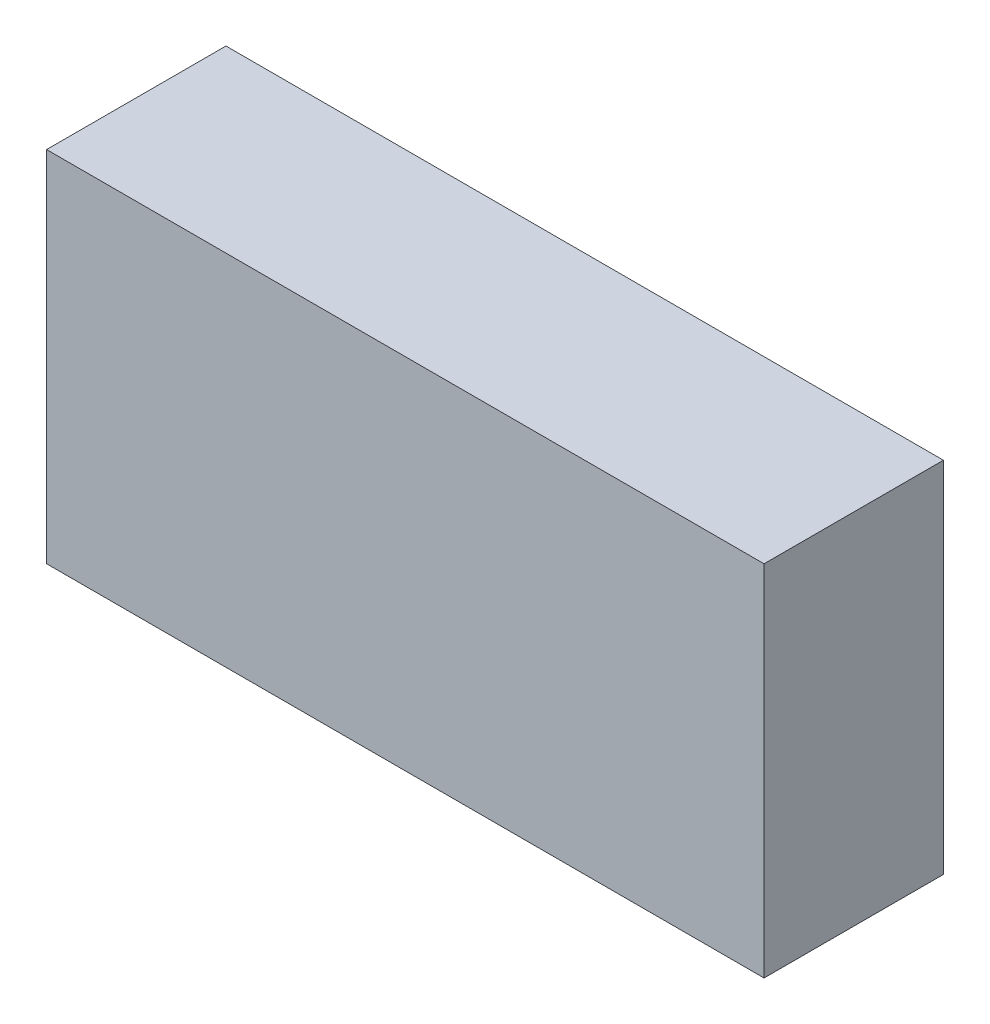
ISO-10303-21;
HEADER;
FILE_DESCRIPTION(('STEP AP214'),'2;1');
FILE_NAME('part.step','',(''),(''),'','','');
FILE_SCHEMA(('AUTOMOTIVE_DESIGN { 1 0 10303 214 1 1 1 1 }'));
ENDSEC;
DATA;
#1=APPLICATION_CONTEXT('core data for automotive mechanical design processes');
#2=APPLICATION_PROTOCOL_DEFINITION('international standard','automotive_design',2000,#1);
#3=PRODUCT_CONTEXT('',#1,'mechanical');
#4=PRODUCT('Part','Part','',(#3));
#5=PRODUCT_RELATED_PRODUCT_CATEGORY('part','',(#4));
#6=PRODUCT_DEFINITION_FORMATION('','',#4);
#7=PRODUCT_DEFINITION_CONTEXT('part definition',#1,'design');
#8=PRODUCT_DEFINITION('design','',#6,#7);
#9=PRODUCT_DEFINITION_SHAPE('','',#8);
#10=(LENGTH_UNIT() NAMED_UNIT(*) SI_UNIT(.MILLI.,.METRE.));
#11=(NAMED_UNIT(*) PLANE_ANGLE_UNIT() SI_UNIT($,.RADIAN.));
#12=(NAMED_UNIT(*) SI_UNIT($,.STERADIAN.) SOLID_ANGLE_UNIT());
#13=UNCERTAINTY_MEASURE_WITH_UNIT(LENGTH_MEASURE(1.E-05),#10,'distance_accuracy_value','');
#14=(GEOMETRIC_REPRESENTATION_CONTEXT(3) GLOBAL_UNCERTAINTY_ASSIGNED_CONTEXT((#13)) GLOBAL_UNIT_ASSIGNED_CONTEXT((#10,
#11,#12)) REPRESENTATION_CONTEXT('',''));
#15=CARTESIAN_POINT('',(0.,0.,0.));
#16=DIRECTION('',(0.,0.,1.));
#17=DIRECTION('',(1.,0.,0.));
#18=AXIS2_PLACEMENT_3D('',#15,#16,#17);
#19=CARTESIAN_POINT('',(0.,0.,0.));
#20=DIRECTION('',(0.,0.,1.));
#21=DIRECTION('',(1.,0.,0.));
#22=AXIS2_PLACEMENT_3D('',#19,#20,#21);
#23=PLANE('',#22);
#24=DIRECTION('',(0.,-1.,0.));
#25=VECTOR('',#24,1.);
#26=CARTESIAN_POINT('',(0.,20.,0.));
#27=LINE('',#26,#25);
#28=CARTESIAN_POINT('',(0.,20.,0.));
#29=VERTEX_POINT('',#28);
#30=CARTESIAN_POINT('',(0.,0.,0.));
#31=VERTEX_POINT('',#30);
#32=EDGE_CURVE('E127',#29,#31,#27,.T.);
#33=ORIENTED_EDGE('',*,*,#32,.F.);
#34=DIRECTION('',(-1.,0.,0.));
#35=VECTOR('',#34,1.);
#36=CARTESIAN_POINT('',(40.,20.,0.));
#37=LINE('',#36,#35);
#38=CARTESIAN_POINT('',(40.,20.,0.));
#39=VERTEX_POINT('',#38);
#40=EDGE_CURVE('E140',#39,#29,#37,.T.);
#41=ORIENTED_EDGE('',*,*,#40,.F.);
#42=DIRECTION('',(0.,1.,0.));
#43=VECTOR('',#42,1.);
#44=CARTESIAN_POINT('',(40.,0.,0.));
#45=LINE('',#44,#43);
#46=CARTESIAN_POINT('',(40.,0.,0.));
#47=VERTEX_POINT('',#46);
#48=EDGE_CURVE('E148',#47,#39,#45,.T.);
#49=ORIENTED_EDGE('',*,*,#48,.F.);
#50=DIRECTION('',(1.,0.,0.));
#51=VECTOR('',#50,1.);
#52=CARTESIAN_POINT('',(0.,0.,0.));
#53=LINE('',#52,#51);
#54=EDGE_CURVE('E130',#31,#47,#53,.T.);
#55=ORIENTED_EDGE('',*,*,#54,.F.);
#56=EDGE_LOOP('',(#33,#41,#49,#55));
#57=FACE_BOUND('',#56,.T.);
#58=DIRECTION('',(0.,1.,0.));
#59=VECTOR('',#58,1.);
#60=CARTESIAN_POINT('',(18.,8.,0.));
#61=LINE('',#60,#59);
#62=CARTESIAN_POINT('',(18.,8.,0.));
#63=VERTEX_POINT('',#62);
#64=CARTESIAN_POINT('',(18.,12.,0.));
#65=VERTEX_POINT('',#64);
#66=EDGE_CURVE('E126',#63,#65,#61,.T.);
#67=ORIENTED_EDGE('',*,*,#66,.F.);
#68=DIRECTION('',(-1.,0.,0.));
#69=VECTOR('',#68,1.);
#70=CARTESIAN_POINT('',(22.,8.,0.));
#71=LINE('',#70,#69);
#72=CARTESIAN_POINT('',(22.,8.,0.));
#73=VERTEX_POINT('',#72);
#74=EDGE_CURVE('E123',#73,#63,#71,.T.);
#75=ORIENTED_EDGE('',*,*,#74,.F.);
#76=DIRECTION('',(0.,-1.,0.));
#77=VECTOR('',#76,1.);
#78=CARTESIAN_POINT('',(22.,12.,0.));
#79=LINE('',#78,#77);
#80=CARTESIAN_POINT('',(22.,12.,0.));
#81=VERTEX_POINT('',#80);
#82=EDGE_CURVE('E61',#81,#73,#79,.T.);
#83=ORIENTED_EDGE('',*,*,#82,.F.);
#84=DIRECTION('',(1.,0.,0.));
#85=VECTOR('',#84,1.);
#86=CARTESIAN_POINT('',(18.,12.,0.));
#87=LINE('',#86,#85);
#88=EDGE_CURVE('E56',#65,#81,#87,.T.);
#89=ORIENTED_EDGE('',*,*,#88,.F.);
#90=EDGE_LOOP('',(#67,#75,#83,#89));
#91=FACE_BOUND('',#90,.T.);
#92=ADVANCED_FACE('F41',(#57,#91),#23,.F.);
#93=CARTESIAN_POINT('',(0.,20.,10.));
#94=DIRECTION('',(1.,0.,0.));
#95=DIRECTION('',(0.,0.,-1.));
#96=AXIS2_PLACEMENT_3D('',#93,#94,#95);
#97=PLANE('',#96);
#98=ORIENTED_EDGE('',*,*,#32,.T.);
#99=DIRECTION('',(0.,0.,-1.));
#100=VECTOR('',#99,1.);
#101=CARTESIAN_POINT('',(0.,0.,10.));
#102=LINE('',#101,#100);
#103=CARTESIAN_POINT('',(0.,0.,10.));
#104=VERTEX_POINT('',#103);
#105=EDGE_CURVE('E11',#104,#31,#102,.T.);
#106=ORIENTED_EDGE('',*,*,#105,.F.);
#107=DIRECTION('',(0.,-1.,0.));
#108=VECTOR('',#107,1.);
#109=CARTESIAN_POINT('',(0.,20.,10.));
#110=LINE('',#109,#108);
#111=CARTESIAN_POINT('',(0.,20.,10.));
#112=VERTEX_POINT('',#111);
#113=EDGE_CURVE('E136',#112,#104,#110,.T.);
#114=ORIENTED_EDGE('',*,*,#113,.F.);
#115=DIRECTION('',(0.,0.,-1.));
#116=VECTOR('',#115,1.);
#117=CARTESIAN_POINT('',(0.,20.,10.));
#118=LINE('',#117,#116);
#119=EDGE_CURVE('E145',#112,#29,#118,.T.);
#120=ORIENTED_EDGE('',*,*,#119,.T.);
#121=EDGE_LOOP('',(#98,#106,#114,#120));
#122=FACE_BOUND('',#121,.T.);
#123=ADVANCED_FACE('F43',(#122),#97,.F.);
#124=CARTESIAN_POINT('',(0.,0.,10.));
#125=DIRECTION('',(0.,1.,0.));
#126=DIRECTION('',(0.,0.,1.));
#127=AXIS2_PLACEMENT_3D('',#124,#125,#126);
#128=PLANE('',#127);
#129=ORIENTED_EDGE('',*,*,#54,.T.);
#130=DIRECTION('',(0.,0.,-1.));
#131=VECTOR('',#130,1.);
#132=CARTESIAN_POINT('',(40.,0.,10.));
#133=LINE('',#132,#131);
#134=CARTESIAN_POINT('',(40.,0.,10.));
#135=VERTEX_POINT('',#134);
#136=EDGE_CURVE('E49',#135,#47,#133,.T.);
#137=ORIENTED_EDGE('',*,*,#136,.F.);
#138=DIRECTION('',(1.,0.,0.));
#139=VECTOR('',#138,1.);
#140=CARTESIAN_POINT('',(0.,0.,10.));
#141=LINE('',#140,#139);
#142=EDGE_CURVE('E139',#104,#135,#141,.T.);
#143=ORIENTED_EDGE('',*,*,#142,.F.);
#144=ORIENTED_EDGE('',*,*,#105,.T.);
#145=EDGE_LOOP('',(#129,#137,#143,#144));
#146=FACE_BOUND('',#145,.T.);
#147=ADVANCED_FACE('F175',(#146),#128,.F.);
#148=CARTESIAN_POINT('',(40.,0.,10.));
#149=DIRECTION('',(-1.,0.,0.));
#150=DIRECTION('',(0.,0.,1.));
#151=AXIS2_PLACEMENT_3D('',#148,#149,#150);
#152=PLANE('',#151);
#153=ORIENTED_EDGE('',*,*,#48,.T.);
#154=DIRECTION('',(0.,0.,-1.));
#155=VECTOR('',#154,1.);
#156=CARTESIAN_POINT('',(40.,20.,10.));
#157=LINE('',#156,#155);
#158=CARTESIAN_POINT('',(40.,20.,10.));
#159=VERTEX_POINT('',#158);
#160=EDGE_CURVE('E153',#159,#39,#157,.T.);
#161=ORIENTED_EDGE('',*,*,#160,.F.);
#162=DIRECTION('',(0.,1.,0.));
#163=VECTOR('',#162,1.);
#164=CARTESIAN_POINT('',(40.,0.,10.));
#165=LINE('',#164,#163);
#166=EDGE_CURVE('E142',#135,#159,#165,.T.);
#167=ORIENTED_EDGE('',*,*,#166,.F.);
#168=ORIENTED_EDGE('',*,*,#136,.T.);
#169=EDGE_LOOP('',(#153,#161,#167,#168));
#170=FACE_BOUND('',#169,.T.);
#171=ADVANCED_FACE('F160',(#170),#152,.F.);
#172=CARTESIAN_POINT('',(40.,20.,10.));
#173=DIRECTION('',(0.,-1.,0.));
#174=DIRECTION('',(0.,0.,-1.));
#175=AXIS2_PLACEMENT_3D('',#172,#173,#174);
#176=PLANE('',#175);
#177=ORIENTED_EDGE('',*,*,#40,.T.);
#178=ORIENTED_EDGE('',*,*,#119,.F.);
#179=DIRECTION('',(-1.,0.,0.));
#180=VECTOR('',#179,1.);
#181=CARTESIAN_POINT('',(40.,20.,10.));
#182=LINE('',#181,#180);
#183=EDGE_CURVE('E144',#159,#112,#182,.T.);
#184=ORIENTED_EDGE('',*,*,#183,.F.);
#185=ORIENTED_EDGE('',*,*,#160,.T.);
#186=EDGE_LOOP('',(#177,#178,#184,#185));
#187=FACE_BOUND('',#186,.T.);
#188=ADVANCED_FACE('F168',(#187),#176,.F.);
#189=CARTESIAN_POINT('',(0.,0.,10.));
#190=DIRECTION('',(0.,0.,1.));
#191=DIRECTION('',(1.,0.,0.));
#192=AXIS2_PLACEMENT_3D('',#189,#190,#191);
#193=PLANE('',#192);
#194=ORIENTED_EDGE('',*,*,#113,.T.);
#195=ORIENTED_EDGE('',*,*,#142,.T.);
#196=ORIENTED_EDGE('',*,*,#166,.T.);
#197=ORIENTED_EDGE('',*,*,#183,.T.);
#198=EDGE_LOOP('',(#194,#195,#196,#197));
#199=FACE_BOUND('',#198,.T.);
#200=ADVANCED_FACE('F174',(#199),#193,.T.);
#201=CARTESIAN_POINT('',(18.,8.,-5.));
#202=DIRECTION('',(1.,0.,0.));
#203=DIRECTION('',(0.,0.,-1.));
#204=AXIS2_PLACEMENT_3D('',#201,#202,#203);
#205=PLANE('',#204);
#206=ORIENTED_EDGE('',*,*,#66,.T.);
#207=DIRECTION('',(0.,0.,1.));
#208=VECTOR('',#207,1.);
#209=CARTESIAN_POINT('',(18.,12.,-5.));
#210=LINE('',#209,#208);
#211=CARTESIAN_POINT('',(18.,12.,-5.));
#212=VERTEX_POINT('',#211);
#213=EDGE_CURVE('E107',#212,#65,#210,.T.);
#214=ORIENTED_EDGE('',*,*,#213,.F.);
#215=DIRECTION('',(0.,1.,0.));
#216=VECTOR('',#215,1.);
#217=CARTESIAN_POINT('',(18.,8.,-5.));
#218=LINE('',#217,#216);
#219=CARTESIAN_POINT('',(18.,8.,-5.));
#220=VERTEX_POINT('',#219);
#221=EDGE_CURVE('E114',#220,#212,#218,.T.);
#222=ORIENTED_EDGE('',*,*,#221,.F.);
#223=DIRECTION('',(0.,0.,1.));
#224=VECTOR('',#223,1.);
#225=CARTESIAN_POINT('',(18.,8.,-5.));
#226=LINE('',#225,#224);
#227=EDGE_CURVE('E268',#220,#63,#226,.T.);
#228=ORIENTED_EDGE('',*,*,#227,.T.);
#229=EDGE_LOOP('',(#206,#214,#222,#228));
#230=FACE_BOUND('',#229,.T.);
#231=ADVANCED_FACE('F125',(#230),#205,.F.);
#232=CARTESIAN_POINT('',(18.,12.,-5.));
#233=DIRECTION('',(0.,-1.,0.));
#234=DIRECTION('',(0.,0.,-1.));
#235=AXIS2_PLACEMENT_3D('',#232,#233,#234);
#236=PLANE('',#235);
#237=ORIENTED_EDGE('',*,*,#88,.T.);
#238=DIRECTION('',(0.,0.,1.));
#239=VECTOR('',#238,1.);
#240=CARTESIAN_POINT('',(22.,12.,-5.));
#241=LINE('',#240,#239);
#242=CARTESIAN_POINT('',(22.,12.,-5.));
#243=VERTEX_POINT('',#242);
#244=EDGE_CURVE('E110',#243,#81,#241,.T.);
#245=ORIENTED_EDGE('',*,*,#244,.F.);
#246=DIRECTION('',(1.,0.,0.));
#247=VECTOR('',#246,1.);
#248=CARTESIAN_POINT('',(18.,12.,-5.));
#249=LINE('',#248,#247);
#250=EDGE_CURVE('E103',#212,#243,#249,.T.);
#251=ORIENTED_EDGE('',*,*,#250,.F.);
#252=ORIENTED_EDGE('',*,*,#213,.T.);
#253=EDGE_LOOP('',(#237,#245,#251,#252));
#254=FACE_BOUND('',#253,.T.);
#255=ADVANCED_FACE('F105',(#254),#236,.F.);
#256=CARTESIAN_POINT('',(22.,12.,-5.));
#257=DIRECTION('',(-1.,0.,0.));
#258=DIRECTION('',(0.,0.,1.));
#259=AXIS2_PLACEMENT_3D('',#256,#257,#258);
#260=PLANE('',#259);
#261=ORIENTED_EDGE('',*,*,#82,.T.);
#262=DIRECTION('',(0.,0.,1.));
#263=VECTOR('',#262,1.);
#264=CARTESIAN_POINT('',(22.,8.,-5.));
#265=LINE('',#264,#263);
#266=CARTESIAN_POINT('',(22.,8.,-5.));
#267=VERTEX_POINT('',#266);
#268=EDGE_CURVE('E132',#267,#73,#265,.T.);
#269=ORIENTED_EDGE('',*,*,#268,.F.);
#270=DIRECTION('',(0.,-1.,0.));
#271=VECTOR('',#270,1.);
#272=CARTESIAN_POINT('',(22.,12.,-5.));
#273=LINE('',#272,#271);
#274=EDGE_CURVE('E113',#243,#267,#273,.T.);
#275=ORIENTED_EDGE('',*,*,#274,.F.);
#276=ORIENTED_EDGE('',*,*,#244,.T.);
#277=EDGE_LOOP('',(#261,#269,#275,#276));
#278=FACE_BOUND('',#277,.T.);
#279=ADVANCED_FACE('F199',(#278),#260,.F.);
#280=CARTESIAN_POINT('',(22.,8.,-5.));
#281=DIRECTION('',(0.,1.,0.));
#282=DIRECTION('',(0.,0.,1.));
#283=AXIS2_PLACEMENT_3D('',#280,#281,#282);
#284=PLANE('',#283);
#285=ORIENTED_EDGE('',*,*,#74,.T.);
#286=ORIENTED_EDGE('',*,*,#227,.F.);
#287=DIRECTION('',(-1.,0.,0.));
#288=VECTOR('',#287,1.);
#289=CARTESIAN_POINT('',(22.,8.,-5.));
#290=LINE('',#289,#288);
#291=EDGE_CURVE('E119',#267,#220,#290,.T.);
#292=ORIENTED_EDGE('',*,*,#291,.F.);
#293=ORIENTED_EDGE('',*,*,#268,.T.);
#294=EDGE_LOOP('',(#285,#286,#292,#293));
#295=FACE_BOUND('',#294,.T.);
#296=ADVANCED_FACE('F204',(#295),#284,.F.);
#297=CARTESIAN_POINT('',(0.,0.,-5.));
#298=DIRECTION('',(0.,0.,-1.));
#299=DIRECTION('',(-1.,0.,0.));
#300=AXIS2_PLACEMENT_3D('',#297,#298,#299);
#301=PLANE('',#300);
#302=ORIENTED_EDGE('',*,*,#221,.T.);
#303=ORIENTED_EDGE('',*,*,#250,.T.);
#304=ORIENTED_EDGE('',*,*,#274,.T.);
#305=ORIENTED_EDGE('',*,*,#291,.T.);
#306=EDGE_LOOP('',(#302,#303,#304,#305));
#307=FACE_BOUND('',#306,.T.);
#308=ADVANCED_FACE('F117',(#307),#301,.T.);
#309=CLOSED_SHELL('',(#92,#123,#147,#171,#188,#200,#231,#255,#279,#296,#308));
#310=MANIFOLD_SOLID_BREP('B2',#309);
#311=ADVANCED_BREP_SHAPE_REPRESENTATION('',(#18,#310),#14);
#312=SHAPE_DEFINITION_REPRESENTATION(#9,#311);
ENDSEC;
END-ISO-10303-21;
